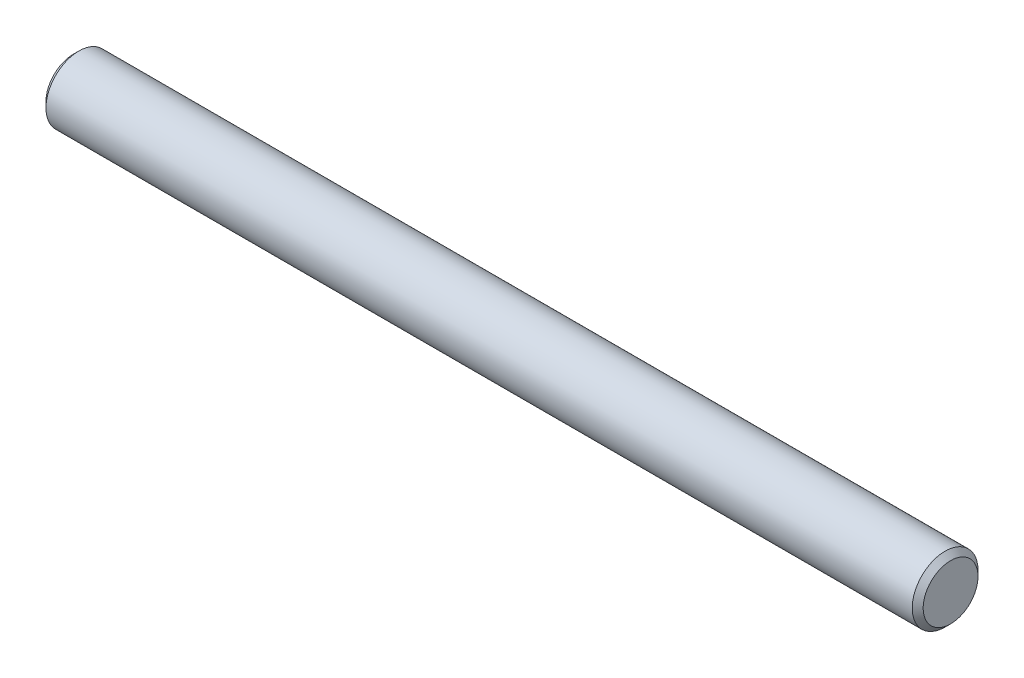
ISO-10303-21;
HEADER;
FILE_DESCRIPTION(('STEP AP214'),'2;1');
FILE_NAME('part.step','',(''),(''),'','','');
FILE_SCHEMA(('AUTOMOTIVE_DESIGN { 1 0 10303 214 1 1 1 1 }'));
ENDSEC;
DATA;
#1=APPLICATION_CONTEXT('core data for automotive mechanical design processes');
#2=APPLICATION_PROTOCOL_DEFINITION('international standard','automotive_design',2000,#1);
#3=PRODUCT_CONTEXT('',#1,'mechanical');
#4=PRODUCT('Part','Part','',(#3));
#5=PRODUCT_RELATED_PRODUCT_CATEGORY('part','',(#4));
#6=PRODUCT_DEFINITION_FORMATION('','',#4);
#7=PRODUCT_DEFINITION_CONTEXT('part definition',#1,'design');
#8=PRODUCT_DEFINITION('design','',#6,#7);
#9=PRODUCT_DEFINITION_SHAPE('','',#8);
#10=(LENGTH_UNIT() NAMED_UNIT(*) SI_UNIT(.MILLI.,.METRE.));
#11=(NAMED_UNIT(*) PLANE_ANGLE_UNIT() SI_UNIT($,.RADIAN.));
#12=(NAMED_UNIT(*) SI_UNIT($,.STERADIAN.) SOLID_ANGLE_UNIT());
#13=UNCERTAINTY_MEASURE_WITH_UNIT(LENGTH_MEASURE(1.E-05),#10,'distance_accuracy_value','');
#14=(GEOMETRIC_REPRESENTATION_CONTEXT(3) GLOBAL_UNCERTAINTY_ASSIGNED_CONTEXT((#13)) GLOBAL_UNIT_ASSIGNED_CONTEXT((#10,
#11,#12)) REPRESENTATION_CONTEXT('',''));
#15=CARTESIAN_POINT('',(0.,0.,0.));
#16=DIRECTION('',(0.,0.,1.));
#17=DIRECTION('',(1.,0.,0.));
#18=AXIS2_PLACEMENT_3D('',#15,#16,#17);
#19=CARTESIAN_POINT('',(20.,0.,0.));
#20=DIRECTION('',(-1.,0.,0.));
#21=DIRECTION('',(0.,0.,1.));
#22=AXIS2_PLACEMENT_3D('',#19,#20,#21);
#23=CYLINDRICAL_SURFACE('',#22,1.5);
#24=CARTESIAN_POINT('',(-19.75,0.,0.));
#25=DIRECTION('',(1.,0.,0.));
#26=DIRECTION('',(0.,0.,-1.));
#27=AXIS2_PLACEMENT_3D('',#24,#25,#26);
#28=CIRCLE('',#27,1.5);
#29=CARTESIAN_POINT('',(-19.75,0.,-1.5));
#30=VERTEX_POINT('',#29);
#31=EDGE_CURVE('E45',#30,#30,#28,.T.);
#32=ORIENTED_EDGE('',*,*,#31,.T.);
#33=EDGE_LOOP('',(#32));
#34=FACE_BOUND('',#33,.T.);
#35=CARTESIAN_POINT('',(19.75,0.,0.));
#36=DIRECTION('',(1.,0.,0.));
#37=DIRECTION('',(0.,0.,-1.));
#38=AXIS2_PLACEMENT_3D('',#35,#36,#37);
#39=CIRCLE('',#38,1.5);
#40=CARTESIAN_POINT('',(19.75,0.,-1.5));
#41=VERTEX_POINT('',#40);
#42=EDGE_CURVE('E49',#41,#41,#39,.F.);
#43=ORIENTED_EDGE('',*,*,#42,.T.);
#44=EDGE_LOOP('',(#43));
#45=FACE_BOUND('',#44,.T.);
#46=ADVANCED_FACE('F34',(#34,#45),#23,.T.);
#47=CARTESIAN_POINT('',(20.,0.,0.));
#48=DIRECTION('',(1.,0.,0.));
#49=DIRECTION('',(0.,0.,-1.));
#50=AXIS2_PLACEMENT_3D('',#47,#48,#49);
#51=PLANE('',#50);
#52=CARTESIAN_POINT('',(20.,0.,0.));
#53=DIRECTION('',(1.,0.,0.));
#54=DIRECTION('',(0.,0.,-1.));
#55=AXIS2_PLACEMENT_3D('',#52,#53,#54);
#56=CIRCLE('',#55,1.25);
#57=CARTESIAN_POINT('',(20.,0.,-1.25));
#58=VERTEX_POINT('',#57);
#59=EDGE_CURVE('E10',#58,#58,#56,.T.);
#60=ORIENTED_EDGE('',*,*,#59,.T.);
#61=EDGE_LOOP('',(#60));
#62=FACE_BOUND('',#61,.T.);
#63=ADVANCED_FACE('F65',(#62),#51,.T.);
#64=CARTESIAN_POINT('',(-20.,0.,0.));
#65=DIRECTION('',(1.,0.,0.));
#66=DIRECTION('',(0.,0.,-1.));
#67=AXIS2_PLACEMENT_3D('',#64,#65,#66);
#68=PLANE('',#67);
#69=CARTESIAN_POINT('',(-20.,0.,0.));
#70=DIRECTION('',(1.,0.,0.));
#71=DIRECTION('',(0.,0.,-1.));
#72=AXIS2_PLACEMENT_3D('',#69,#70,#71);
#73=CIRCLE('',#72,1.25);
#74=CARTESIAN_POINT('',(-20.,0.,-1.25));
#75=VERTEX_POINT('',#74);
#76=EDGE_CURVE('E41',#75,#75,#73,.F.);
#77=ORIENTED_EDGE('',*,*,#76,.T.);
#78=EDGE_LOOP('',(#77));
#79=FACE_BOUND('',#78,.T.);
#80=ADVANCED_FACE('F62',(#79),#68,.F.);
#81=CARTESIAN_POINT('',(-19.75,0.,0.));
#82=DIRECTION('',(1.,0.,0.));
#83=DIRECTION('',(0.,0.,-1.));
#84=AXIS2_PLACEMENT_3D('',#81,#82,#83);
#85=CONICAL_SURFACE('',#84,1.5,0.785398163397453);
#86=ORIENTED_EDGE('',*,*,#76,.F.);
#87=EDGE_LOOP('',(#86));
#88=FACE_BOUND('',#87,.T.);
#89=ORIENTED_EDGE('',*,*,#31,.F.);
#90=EDGE_LOOP('',(#89));
#91=FACE_BOUND('',#90,.T.);
#92=ADVANCED_FACE('F58',(#88,#91),#85,.T.);
#93=CARTESIAN_POINT('',(20.,0.,0.));
#94=DIRECTION('',(-1.,0.,0.));
#95=DIRECTION('',(0.,0.,1.));
#96=AXIS2_PLACEMENT_3D('',#93,#94,#95);
#97=CONICAL_SURFACE('',#96,1.25,0.785398163397446);
#98=ORIENTED_EDGE('',*,*,#42,.F.);
#99=EDGE_LOOP('',(#98));
#100=FACE_BOUND('',#99,.T.);
#101=ORIENTED_EDGE('',*,*,#59,.F.);
#102=EDGE_LOOP('',(#101));
#103=FACE_BOUND('',#102,.T.);
#104=ADVANCED_FACE('F36',(#100,#103),#97,.T.);
#105=CLOSED_SHELL('',(#46,#63,#80,#92,#104));
#106=MANIFOLD_SOLID_BREP('B2',#105);
#107=ADVANCED_BREP_SHAPE_REPRESENTATION('',(#18,#106),#14);
#108=SHAPE_DEFINITION_REPRESENTATION(#9,#107);
ENDSEC;
END-ISO-10303-21;
